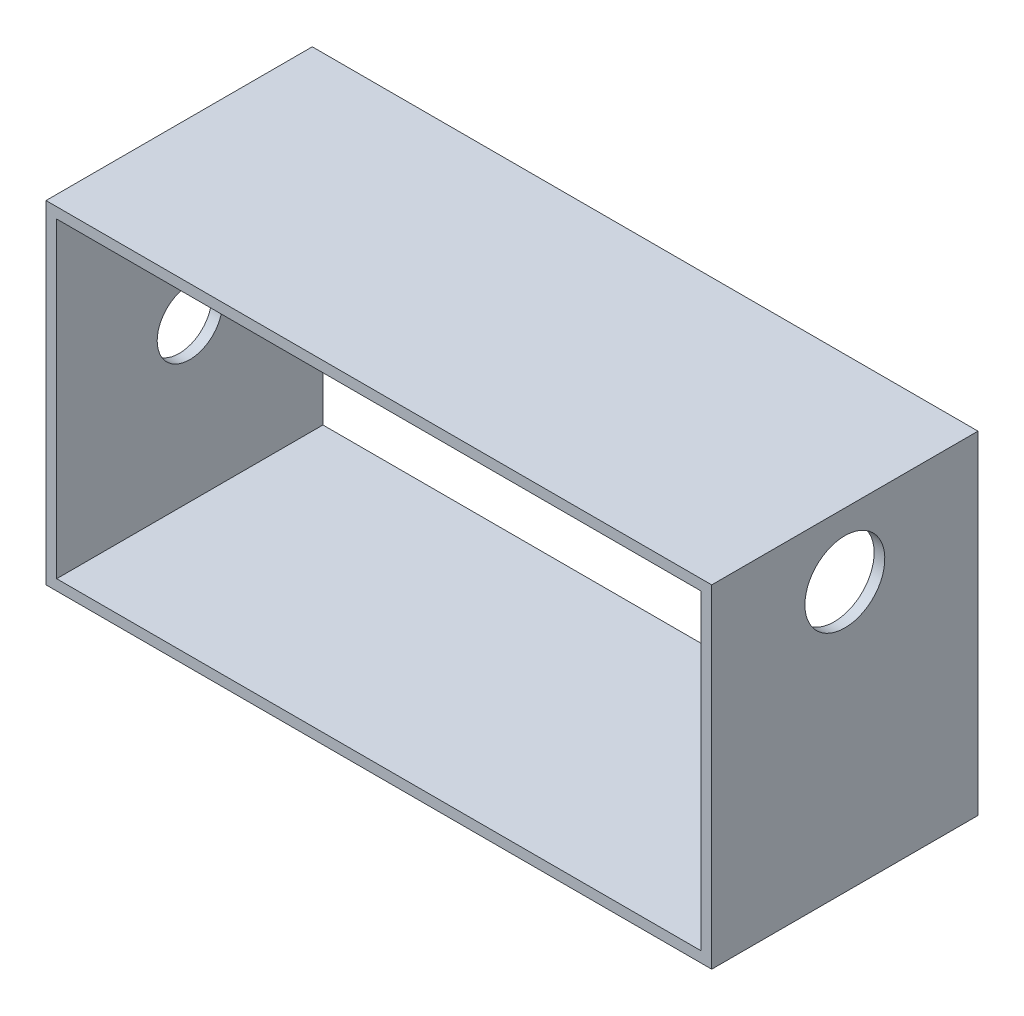
ISO-10303-21;
HEADER;
FILE_DESCRIPTION(('STEP AP214'),'2;1');
FILE_NAME('part.step','',(''),(''),'','','');
FILE_SCHEMA(('AUTOMOTIVE_DESIGN { 1 0 10303 214 1 1 1 1 }'));
ENDSEC;
DATA;
#1=APPLICATION_CONTEXT('core data for automotive mechanical design processes');
#2=APPLICATION_PROTOCOL_DEFINITION('international standard','automotive_design',2000,#1);
#3=PRODUCT_CONTEXT('',#1,'mechanical');
#4=PRODUCT('Part','Part','',(#3));
#5=PRODUCT_RELATED_PRODUCT_CATEGORY('part','',(#4));
#6=PRODUCT_DEFINITION_FORMATION('','',#4);
#7=PRODUCT_DEFINITION_CONTEXT('part definition',#1,'design');
#8=PRODUCT_DEFINITION('design','',#6,#7);
#9=PRODUCT_DEFINITION_SHAPE('','',#8);
#10=(LENGTH_UNIT() NAMED_UNIT(*) SI_UNIT(.MILLI.,.METRE.));
#11=(NAMED_UNIT(*) PLANE_ANGLE_UNIT() SI_UNIT($,.RADIAN.));
#12=(NAMED_UNIT(*) SI_UNIT($,.STERADIAN.) SOLID_ANGLE_UNIT());
#13=UNCERTAINTY_MEASURE_WITH_UNIT(LENGTH_MEASURE(1.E-05),#10,'distance_accuracy_value','');
#14=(GEOMETRIC_REPRESENTATION_CONTEXT(3) GLOBAL_UNCERTAINTY_ASSIGNED_CONTEXT((#13)) GLOBAL_UNIT_ASSIGNED_CONTEXT((#10,
#11,#12)) REPRESENTATION_CONTEXT('',''));
#15=CARTESIAN_POINT('',(0.,0.,0.));
#16=DIRECTION('',(0.,0.,1.));
#17=DIRECTION('',(1.,0.,0.));
#18=AXIS2_PLACEMENT_3D('',#15,#16,#17);
#19=CARTESIAN_POINT('',(0.,0.,100.));
#20=DIRECTION('',(0.,0.,1.));
#21=DIRECTION('',(1.,0.,0.));
#22=AXIS2_PLACEMENT_3D('',#19,#20,#21);
#23=PLANE('',#22);
#24=DIRECTION('',(0.,-1.,0.));
#25=VECTOR('',#24,1.);
#26=CARTESIAN_POINT('',(0.,125.,100.));
#27=LINE('',#26,#25);
#28=CARTESIAN_POINT('',(0.,125.,100.));
#29=VERTEX_POINT('',#28);
#30=CARTESIAN_POINT('',(0.,0.,100.));
#31=VERTEX_POINT('',#30);
#32=EDGE_CURVE('E142',#29,#31,#27,.T.);
#33=ORIENTED_EDGE('',*,*,#32,.T.);
#34=DIRECTION('',(1.,0.,0.));
#35=VECTOR('',#34,1.);
#36=CARTESIAN_POINT('',(0.,0.,100.));
#37=LINE('',#36,#35);
#38=CARTESIAN_POINT('',(250.,0.,100.));
#39=VERTEX_POINT('',#38);
#40=EDGE_CURVE('E145',#31,#39,#37,.T.);
#41=ORIENTED_EDGE('',*,*,#40,.T.);
#42=DIRECTION('',(0.,1.,0.));
#43=VECTOR('',#42,1.);
#44=CARTESIAN_POINT('',(250.,125.,100.));
#45=LINE('',#44,#43);
#46=CARTESIAN_POINT('',(250.,125.,100.));
#47=VERTEX_POINT('',#46);
#48=EDGE_CURVE('E148',#39,#47,#45,.T.);
#49=ORIENTED_EDGE('',*,*,#48,.T.);
#50=DIRECTION('',(-1.,0.,0.));
#51=VECTOR('',#50,1.);
#52=CARTESIAN_POINT('',(0.,125.,100.));
#53=LINE('',#52,#51);
#54=EDGE_CURVE('E150',#47,#29,#53,.T.);
#55=ORIENTED_EDGE('',*,*,#54,.T.);
#56=EDGE_LOOP('',(#33,#41,#49,#55));
#57=FACE_BOUND('',#56,.T.);
#58=DIRECTION('',(-1.,0.,0.));
#59=VECTOR('',#58,1.);
#60=CARTESIAN_POINT('',(246.,121.,100.));
#61=LINE('',#60,#59);
#62=CARTESIAN_POINT('',(246.,121.,100.));
#63=VERTEX_POINT('',#62);
#64=CARTESIAN_POINT('',(4.00000000000001,121.,100.));
#65=VERTEX_POINT('',#64);
#66=EDGE_CURVE('E113',#63,#65,#61,.T.);
#67=ORIENTED_EDGE('',*,*,#66,.F.);
#68=DIRECTION('',(0.,1.,0.));
#69=VECTOR('',#68,1.);
#70=CARTESIAN_POINT('',(246.,121.,100.));
#71=LINE('',#70,#69);
#72=CARTESIAN_POINT('',(246.,4.,100.));
#73=VERTEX_POINT('',#72);
#74=EDGE_CURVE('E105',#73,#63,#71,.T.);
#75=ORIENTED_EDGE('',*,*,#74,.F.);
#76=DIRECTION('',(1.,0.,0.));
#77=VECTOR('',#76,1.);
#78=CARTESIAN_POINT('',(246.,4.,100.));
#79=LINE('',#78,#77);
#80=CARTESIAN_POINT('',(4.00000000000003,3.99999999999998,100.));
#81=VERTEX_POINT('',#80);
#82=EDGE_CURVE('E127',#81,#73,#79,.T.);
#83=ORIENTED_EDGE('',*,*,#82,.F.);
#84=DIRECTION('',(0.,-1.,0.));
#85=VECTOR('',#84,1.);
#86=CARTESIAN_POINT('',(4.00000000000001,121.,100.));
#87=LINE('',#86,#85);
#88=EDGE_CURVE('E125',#65,#81,#87,.T.);
#89=ORIENTED_EDGE('',*,*,#88,.F.);
#90=EDGE_LOOP('',(#67,#75,#83,#89));
#91=FACE_BOUND('',#90,.T.);
#92=ADVANCED_FACE('F39',(#57,#91),#23,.T.);
#93=CARTESIAN_POINT('',(0.,0.,0.));
#94=DIRECTION('',(0.,0.,1.));
#95=DIRECTION('',(1.,0.,0.));
#96=AXIS2_PLACEMENT_3D('',#93,#94,#95);
#97=PLANE('',#96);
#98=DIRECTION('',(0.,-1.,0.));
#99=VECTOR('',#98,1.);
#100=CARTESIAN_POINT('',(0.,125.,0.));
#101=LINE('',#100,#99);
#102=CARTESIAN_POINT('',(0.,125.,0.));
#103=VERTEX_POINT('',#102);
#104=CARTESIAN_POINT('',(0.,0.,0.));
#105=VERTEX_POINT('',#104);
#106=EDGE_CURVE('E121',#103,#105,#101,.T.);
#107=ORIENTED_EDGE('',*,*,#106,.F.);
#108=DIRECTION('',(-1.,0.,0.));
#109=VECTOR('',#108,1.);
#110=CARTESIAN_POINT('',(0.,125.,0.));
#111=LINE('',#110,#109);
#112=CARTESIAN_POINT('',(250.,125.,0.));
#113=VERTEX_POINT('',#112);
#114=EDGE_CURVE('E146',#113,#103,#111,.T.);
#115=ORIENTED_EDGE('',*,*,#114,.F.);
#116=DIRECTION('',(0.,1.,0.));
#117=VECTOR('',#116,1.);
#118=CARTESIAN_POINT('',(250.,125.,0.));
#119=LINE('',#118,#117);
#120=CARTESIAN_POINT('',(250.,0.,0.));
#121=VERTEX_POINT('',#120);
#122=EDGE_CURVE('E157',#121,#113,#119,.T.);
#123=ORIENTED_EDGE('',*,*,#122,.F.);
#124=DIRECTION('',(1.,0.,0.));
#125=VECTOR('',#124,1.);
#126=CARTESIAN_POINT('',(0.,0.,0.));
#127=LINE('',#126,#125);
#128=EDGE_CURVE('E155',#105,#121,#127,.T.);
#129=ORIENTED_EDGE('',*,*,#128,.F.);
#130=EDGE_LOOP('',(#107,#115,#123,#129));
#131=FACE_BOUND('',#130,.T.);
#132=DIRECTION('',(0.,1.,0.));
#133=VECTOR('',#132,1.);
#134=CARTESIAN_POINT('',(246.,121.,0.));
#135=LINE('',#134,#133);
#136=CARTESIAN_POINT('',(246.,4.,0.));
#137=VERTEX_POINT('',#136);
#138=CARTESIAN_POINT('',(246.,121.,0.));
#139=VERTEX_POINT('',#138);
#140=EDGE_CURVE('E63',#137,#139,#135,.T.);
#141=ORIENTED_EDGE('',*,*,#140,.T.);
#142=DIRECTION('',(-1.,0.,0.));
#143=VECTOR('',#142,1.);
#144=CARTESIAN_POINT('',(246.,121.,0.));
#145=LINE('',#144,#143);
#146=CARTESIAN_POINT('',(4.00000000000001,121.,0.));
#147=VERTEX_POINT('',#146);
#148=EDGE_CURVE('E120',#139,#147,#145,.T.);
#149=ORIENTED_EDGE('',*,*,#148,.T.);
#150=DIRECTION('',(0.,-1.,0.));
#151=VECTOR('',#150,1.);
#152=CARTESIAN_POINT('',(4.00000000000001,121.,0.));
#153=LINE('',#152,#151);
#154=CARTESIAN_POINT('',(4.00000000000003,3.99999999999998,0.));
#155=VERTEX_POINT('',#154);
#156=EDGE_CURVE('E134',#147,#155,#153,.T.);
#157=ORIENTED_EDGE('',*,*,#156,.T.);
#158=DIRECTION('',(1.,0.,0.));
#159=VECTOR('',#158,1.);
#160=CARTESIAN_POINT('',(246.,4.,0.));
#161=LINE('',#160,#159);
#162=EDGE_CURVE('E114',#155,#137,#161,.T.);
#163=ORIENTED_EDGE('',*,*,#162,.T.);
#164=EDGE_LOOP('',(#141,#149,#157,#163));
#165=FACE_BOUND('',#164,.T.);
#166=ADVANCED_FACE('F176',(#131,#165),#97,.F.);
#167=CARTESIAN_POINT('',(0.,125.,100.));
#168=DIRECTION('',(1.,0.,0.));
#169=DIRECTION('',(0.,0.,-1.));
#170=AXIS2_PLACEMENT_3D('',#167,#168,#169);
#171=PLANE('',#170);
#172=CARTESIAN_POINT('',(0.,62.5,50.));
#173=DIRECTION('',(-1.,0.,0.));
#174=DIRECTION('',(0.,0.,1.));
#175=AXIS2_PLACEMENT_3D('',#172,#173,#174);
#176=CIRCLE('',#175,12.25);
#177=CARTESIAN_POINT('',(0.,62.5,62.25));
#178=VERTEX_POINT('',#177);
#179=EDGE_CURVE('E223',#178,#178,#176,.T.);
#180=ORIENTED_EDGE('',*,*,#179,.F.);
#181=EDGE_LOOP('',(#180));
#182=FACE_BOUND('',#181,.T.);
#183=ORIENTED_EDGE('',*,*,#106,.T.);
#184=DIRECTION('',(0.,0.,-1.));
#185=VECTOR('',#184,1.);
#186=CARTESIAN_POINT('',(0.,0.,100.));
#187=LINE('',#186,#185);
#188=EDGE_CURVE('E11',#31,#105,#187,.T.);
#189=ORIENTED_EDGE('',*,*,#188,.F.);
#190=ORIENTED_EDGE('',*,*,#32,.F.);
#191=DIRECTION('',(0.,0.,-1.));
#192=VECTOR('',#191,1.);
#193=CARTESIAN_POINT('',(0.,125.,100.));
#194=LINE('',#193,#192);
#195=EDGE_CURVE('E152',#29,#103,#194,.T.);
#196=ORIENTED_EDGE('',*,*,#195,.T.);
#197=EDGE_LOOP('',(#183,#189,#190,#196));
#198=FACE_BOUND('',#197,.T.);
#199=ADVANCED_FACE('F41',(#182,#198),#171,.F.);
#200=CARTESIAN_POINT('',(0.,0.,100.));
#201=DIRECTION('',(0.,1.,0.));
#202=DIRECTION('',(0.,0.,1.));
#203=AXIS2_PLACEMENT_3D('',#200,#201,#202);
#204=PLANE('',#203);
#205=ORIENTED_EDGE('',*,*,#128,.T.);
#206=DIRECTION('',(0.,0.,-1.));
#207=VECTOR('',#206,1.);
#208=CARTESIAN_POINT('',(250.,0.,100.));
#209=LINE('',#208,#207);
#210=EDGE_CURVE('E48',#39,#121,#209,.T.);
#211=ORIENTED_EDGE('',*,*,#210,.F.);
#212=ORIENTED_EDGE('',*,*,#40,.F.);
#213=ORIENTED_EDGE('',*,*,#188,.T.);
#214=EDGE_LOOP('',(#205,#211,#212,#213));
#215=FACE_BOUND('',#214,.T.);
#216=ADVANCED_FACE('F186',(#215),#204,.F.);
#217=CARTESIAN_POINT('',(250.,125.,100.));
#218=DIRECTION('',(-1.,0.,0.));
#219=DIRECTION('',(0.,0.,1.));
#220=AXIS2_PLACEMENT_3D('',#217,#218,#219);
#221=PLANE('',#220);
#222=CARTESIAN_POINT('',(250.,101.,50.));
#223=DIRECTION('',(-1.,0.,0.));
#224=DIRECTION('',(0.,0.,1.));
#225=AXIS2_PLACEMENT_3D('',#222,#223,#224);
#226=CIRCLE('',#225,15.);
#227=CARTESIAN_POINT('',(250.,101.,65.));
#228=VERTEX_POINT('',#227);
#229=EDGE_CURVE('E220',#228,#228,#226,.T.);
#230=ORIENTED_EDGE('',*,*,#229,.T.);
#231=EDGE_LOOP('',(#230));
#232=FACE_BOUND('',#231,.T.);
#233=ORIENTED_EDGE('',*,*,#122,.T.);
#234=DIRECTION('',(0.,0.,-1.));
#235=VECTOR('',#234,1.);
#236=CARTESIAN_POINT('',(250.,125.,100.));
#237=LINE('',#236,#235);
#238=EDGE_CURVE('E162',#47,#113,#237,.T.);
#239=ORIENTED_EDGE('',*,*,#238,.F.);
#240=ORIENTED_EDGE('',*,*,#48,.F.);
#241=ORIENTED_EDGE('',*,*,#210,.T.);
#242=EDGE_LOOP('',(#233,#239,#240,#241));
#243=FACE_BOUND('',#242,.T.);
#244=ADVANCED_FACE('F170',(#232,#243),#221,.F.);
#245=CARTESIAN_POINT('',(0.,125.,100.));
#246=DIRECTION('',(0.,-1.,0.));
#247=DIRECTION('',(1.,0.,0.));
#248=AXIS2_PLACEMENT_3D('',#245,#246,#247);
#249=PLANE('',#248);
#250=ORIENTED_EDGE('',*,*,#114,.T.);
#251=ORIENTED_EDGE('',*,*,#195,.F.);
#252=ORIENTED_EDGE('',*,*,#54,.F.);
#253=ORIENTED_EDGE('',*,*,#238,.T.);
#254=EDGE_LOOP('',(#250,#251,#252,#253));
#255=FACE_BOUND('',#254,.T.);
#256=ADVANCED_FACE('F180',(#255),#249,.F.);
#257=CARTESIAN_POINT('',(246.,121.,100.));
#258=DIRECTION('',(-1.,0.,0.));
#259=DIRECTION('',(0.,-1.,0.));
#260=AXIS2_PLACEMENT_3D('',#257,#258,#259);
#261=PLANE('',#260);
#262=CARTESIAN_POINT('',(246.,101.,50.));
#263=DIRECTION('',(-1.,0.,0.));
#264=DIRECTION('',(0.,-1.,0.));
#265=AXIS2_PLACEMENT_3D('',#262,#263,#264);
#266=CIRCLE('',#265,15.);
#267=CARTESIAN_POINT('',(246.,86.,50.));
#268=VERTEX_POINT('',#267);
#269=EDGE_CURVE('E218',#268,#268,#266,.T.);
#270=ORIENTED_EDGE('',*,*,#269,.F.);
#271=EDGE_LOOP('',(#270));
#272=FACE_BOUND('',#271,.T.);
#273=ORIENTED_EDGE('',*,*,#140,.F.);
#274=DIRECTION('',(0.,0.,-1.));
#275=VECTOR('',#274,1.);
#276=CARTESIAN_POINT('',(246.,4.,100.));
#277=LINE('',#276,#275);
#278=EDGE_CURVE('E109',#73,#137,#277,.T.);
#279=ORIENTED_EDGE('',*,*,#278,.F.);
#280=ORIENTED_EDGE('',*,*,#74,.T.);
#281=DIRECTION('',(0.,0.,-1.));
#282=VECTOR('',#281,1.);
#283=CARTESIAN_POINT('',(246.,121.,100.));
#284=LINE('',#283,#282);
#285=EDGE_CURVE('E108',#63,#139,#284,.T.);
#286=ORIENTED_EDGE('',*,*,#285,.T.);
#287=EDGE_LOOP('',(#273,#279,#280,#286));
#288=FACE_BOUND('',#287,.T.);
#289=ADVANCED_FACE('F107',(#272,#288),#261,.T.);
#290=CARTESIAN_POINT('',(246.,121.,100.));
#291=DIRECTION('',(0.,-1.,0.));
#292=DIRECTION('',(1.,0.,0.));
#293=AXIS2_PLACEMENT_3D('',#290,#291,#292);
#294=PLANE('',#293);
#295=ORIENTED_EDGE('',*,*,#148,.F.);
#296=ORIENTED_EDGE('',*,*,#285,.F.);
#297=ORIENTED_EDGE('',*,*,#66,.T.);
#298=DIRECTION('',(0.,0.,-1.));
#299=VECTOR('',#298,1.);
#300=CARTESIAN_POINT('',(4.00000000000001,121.,100.));
#301=LINE('',#300,#299);
#302=EDGE_CURVE('E122',#65,#147,#301,.T.);
#303=ORIENTED_EDGE('',*,*,#302,.T.);
#304=EDGE_LOOP('',(#295,#296,#297,#303));
#305=FACE_BOUND('',#304,.T.);
#306=ADVANCED_FACE('F117',(#305),#294,.T.);
#307=CARTESIAN_POINT('',(4.00000000000001,121.,100.));
#308=DIRECTION('',(1.,0.,0.));
#309=DIRECTION('',(0.,1.,0.));
#310=AXIS2_PLACEMENT_3D('',#307,#308,#309);
#311=PLANE('',#310);
#312=CARTESIAN_POINT('',(4.00000000000002,62.5,50.));
#313=DIRECTION('',(1.,0.,0.));
#314=DIRECTION('',(0.,1.,0.));
#315=AXIS2_PLACEMENT_3D('',#312,#313,#314);
#316=CIRCLE('',#315,12.25);
#317=CARTESIAN_POINT('',(4.00000000000002,74.75,50.));
#318=VERTEX_POINT('',#317);
#319=EDGE_CURVE('E43',#318,#318,#316,.T.);
#320=ORIENTED_EDGE('',*,*,#319,.F.);
#321=EDGE_LOOP('',(#320));
#322=FACE_BOUND('',#321,.T.);
#323=ORIENTED_EDGE('',*,*,#156,.F.);
#324=ORIENTED_EDGE('',*,*,#302,.F.);
#325=ORIENTED_EDGE('',*,*,#88,.T.);
#326=DIRECTION('',(0.,0.,-1.));
#327=VECTOR('',#326,1.);
#328=CARTESIAN_POINT('',(4.00000000000003,3.99999999999998,100.));
#329=LINE('',#328,#327);
#330=EDGE_CURVE('E55',#81,#155,#329,.T.);
#331=ORIENTED_EDGE('',*,*,#330,.T.);
#332=EDGE_LOOP('',(#323,#324,#325,#331));
#333=FACE_BOUND('',#332,.T.);
#334=ADVANCED_FACE('F215',(#322,#333),#311,.T.);
#335=CARTESIAN_POINT('',(246.,4.,100.));
#336=DIRECTION('',(0.,1.,0.));
#337=DIRECTION('',(-1.,0.,0.));
#338=AXIS2_PLACEMENT_3D('',#335,#336,#337);
#339=PLANE('',#338);
#340=ORIENTED_EDGE('',*,*,#162,.F.);
#341=ORIENTED_EDGE('',*,*,#330,.F.);
#342=ORIENTED_EDGE('',*,*,#82,.T.);
#343=ORIENTED_EDGE('',*,*,#278,.T.);
#344=EDGE_LOOP('',(#340,#341,#342,#343));
#345=FACE_BOUND('',#344,.T.);
#346=ADVANCED_FACE('F235',(#345),#339,.T.);
#347=CARTESIAN_POINT('',(10.,62.5,50.));
#348=DIRECTION('',(-1.,0.,0.));
#349=DIRECTION('',(0.,0.,1.));
#350=AXIS2_PLACEMENT_3D('',#347,#348,#349);
#351=CYLINDRICAL_SURFACE('',#350,12.25);
#352=ORIENTED_EDGE('',*,*,#319,.T.);
#353=EDGE_LOOP('',(#352));
#354=FACE_BOUND('',#353,.T.);
#355=ORIENTED_EDGE('',*,*,#179,.T.);
#356=EDGE_LOOP('',(#355));
#357=FACE_BOUND('',#356,.T.);
#358=ADVANCED_FACE('F231',(#354,#357),#351,.F.);
#359=CARTESIAN_POINT('',(256.,101.,50.));
#360=DIRECTION('',(-1.,0.,0.));
#361=DIRECTION('',(0.,-1.,0.));
#362=AXIS2_PLACEMENT_3D('',#359,#360,#361);
#363=CYLINDRICAL_SURFACE('',#362,15.);
#364=ORIENTED_EDGE('',*,*,#269,.T.);
#365=EDGE_LOOP('',(#364));
#366=FACE_BOUND('',#365,.T.);
#367=ORIENTED_EDGE('',*,*,#229,.F.);
#368=EDGE_LOOP('',(#367));
#369=FACE_BOUND('',#368,.T.);
#370=ADVANCED_FACE('F244',(#366,#369),#363,.F.);
#371=CLOSED_SHELL('',(#92,#166,#199,#216,#244,#256,#289,#306,#334,#346,#358,#370));
#372=MANIFOLD_SOLID_BREP('B2',#371);
#373=ADVANCED_BREP_SHAPE_REPRESENTATION('',(#18,#372),#14);
#374=SHAPE_DEFINITION_REPRESENTATION(#9,#373);
ENDSEC;
END-ISO-10303-21;
